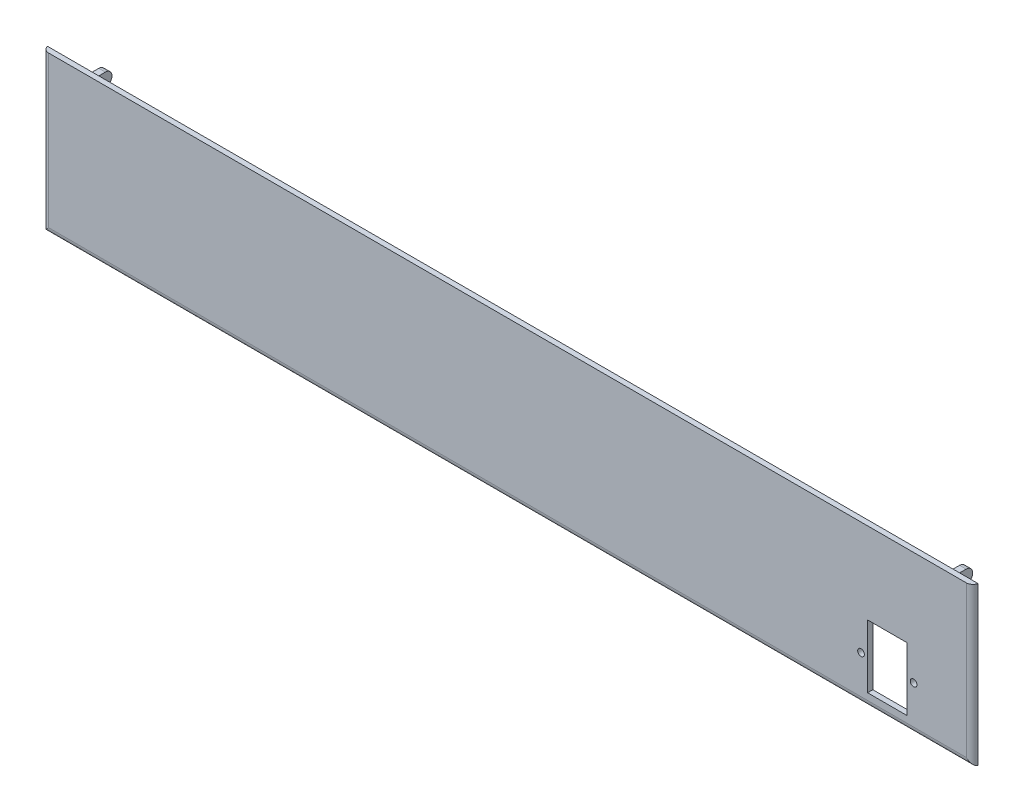
ISO-10303-21;
HEADER;
FILE_DESCRIPTION(('STEP AP214'),'2;1');
FILE_NAME('part.step','',(''),(''),'','','');
FILE_SCHEMA(('AUTOMOTIVE_DESIGN { 1 0 10303 214 1 1 1 1 }'));
ENDSEC;
DATA;
#1=APPLICATION_CONTEXT('core data for automotive mechanical design processes');
#2=APPLICATION_PROTOCOL_DEFINITION('international standard','automotive_design',2000,#1);
#3=PRODUCT_CONTEXT('',#1,'mechanical');
#4=PRODUCT('Part','Part','',(#3));
#5=PRODUCT_RELATED_PRODUCT_CATEGORY('part','',(#4));
#6=PRODUCT_DEFINITION_FORMATION('','',#4);
#7=PRODUCT_DEFINITION_CONTEXT('part definition',#1,'design');
#8=PRODUCT_DEFINITION('design','',#6,#7);
#9=PRODUCT_DEFINITION_SHAPE('','',#8);
#10=(LENGTH_UNIT() NAMED_UNIT(*) SI_UNIT(.MILLI.,.METRE.));
#11=(NAMED_UNIT(*) PLANE_ANGLE_UNIT() SI_UNIT($,.RADIAN.));
#12=(NAMED_UNIT(*) SI_UNIT($,.STERADIAN.) SOLID_ANGLE_UNIT());
#13=UNCERTAINTY_MEASURE_WITH_UNIT(LENGTH_MEASURE(1.E-05),#10,'distance_accuracy_value','');
#14=(GEOMETRIC_REPRESENTATION_CONTEXT(3) GLOBAL_UNCERTAINTY_ASSIGNED_CONTEXT((#13)) GLOBAL_UNIT_ASSIGNED_CONTEXT((#10,
#11,#12)) REPRESENTATION_CONTEXT('',''));
#15=CARTESIAN_POINT('',(0.,0.,0.));
#16=DIRECTION('',(0.,0.,1.));
#17=DIRECTION('',(1.,0.,0.));
#18=AXIS2_PLACEMENT_3D('',#15,#16,#17);
#19=CARTESIAN_POINT('',(0.,0.,0.));
#20=DIRECTION('',(0.,0.,-1.));
#21=DIRECTION('',(-1.,0.,0.));
#22=AXIS2_PLACEMENT_3D('',#19,#20,#21);
#23=PLANE('',#22);
#24=DIRECTION('',(0.,-1.,0.));
#25=VECTOR('',#24,1.);
#26=CARTESIAN_POINT('',(24.,110.,0.));
#27=LINE('',#26,#25);
#28=CARTESIAN_POINT('',(24.,110.,0.));
#29=VERTEX_POINT('',#28);
#30=CARTESIAN_POINT('',(24.,100.,0.));
#31=VERTEX_POINT('',#30);
#32=EDGE_CURVE('E229',#29,#31,#27,.T.);
#33=ORIENTED_EDGE('',*,*,#32,.T.);
#34=DIRECTION('',(1.,0.,0.));
#35=VECTOR('',#34,1.);
#36=CARTESIAN_POINT('',(24.,100.,0.));
#37=LINE('',#36,#35);
#38=CARTESIAN_POINT('',(29.,100.,0.));
#39=VERTEX_POINT('',#38);
#40=EDGE_CURVE('E237',#31,#39,#37,.T.);
#41=ORIENTED_EDGE('',*,*,#40,.T.);
#42=DIRECTION('',(0.,1.,0.));
#43=VECTOR('',#42,1.);
#44=CARTESIAN_POINT('',(29.,110.,0.));
#45=LINE('',#44,#43);
#46=CARTESIAN_POINT('',(29.,110.,0.));
#47=VERTEX_POINT('',#46);
#48=EDGE_CURVE('E251',#39,#47,#45,.T.);
#49=ORIENTED_EDGE('',*,*,#48,.T.);
#50=DIRECTION('',(-1.,0.,0.));
#51=VECTOR('',#50,1.);
#52=CARTESIAN_POINT('',(24.,110.,0.));
#53=LINE('',#52,#51);
#54=EDGE_CURVE('E246',#47,#29,#53,.T.);
#55=ORIENTED_EDGE('',*,*,#54,.T.);
#56=EDGE_LOOP('',(#33,#41,#49,#55));
#57=FACE_BOUND('',#56,.T.);
#58=DIRECTION('',(0.,-1.,0.));
#59=VECTOR('',#58,1.);
#60=CARTESIAN_POINT('',(24.,25.,0.));
#61=LINE('',#60,#59);
#62=CARTESIAN_POINT('',(24.,25.,0.));
#63=VERTEX_POINT('',#62);
#64=CARTESIAN_POINT('',(24.,15.,0.));
#65=VERTEX_POINT('',#64);
#66=EDGE_CURVE('E266',#63,#65,#61,.T.);
#67=ORIENTED_EDGE('',*,*,#66,.T.);
#68=DIRECTION('',(1.,0.,0.));
#69=VECTOR('',#68,1.);
#70=CARTESIAN_POINT('',(24.,15.,0.));
#71=LINE('',#70,#69);
#72=CARTESIAN_POINT('',(29.,15.,0.));
#73=VERTEX_POINT('',#72);
#74=EDGE_CURVE('E275',#65,#73,#71,.T.);
#75=ORIENTED_EDGE('',*,*,#74,.T.);
#76=DIRECTION('',(0.,1.,0.));
#77=VECTOR('',#76,1.);
#78=CARTESIAN_POINT('',(29.,25.,0.));
#79=LINE('',#78,#77);
#80=CARTESIAN_POINT('',(29.,25.,0.));
#81=VERTEX_POINT('',#80);
#82=EDGE_CURVE('E272',#73,#81,#79,.T.);
#83=ORIENTED_EDGE('',*,*,#82,.T.);
#84=DIRECTION('',(-1.,0.,0.));
#85=VECTOR('',#84,1.);
#86=CARTESIAN_POINT('',(24.,25.,0.));
#87=LINE('',#86,#85);
#88=EDGE_CURVE('E269',#81,#63,#87,.T.);
#89=ORIENTED_EDGE('',*,*,#88,.T.);
#90=EDGE_LOOP('',(#67,#75,#83,#89));
#91=FACE_BOUND('',#90,.T.);
#92=DIRECTION('',(0.,-1.,0.));
#93=VECTOR('',#92,1.);
#94=CARTESIAN_POINT('',(684.,25.,0.));
#95=LINE('',#94,#93);
#96=CARTESIAN_POINT('',(684.,25.,0.));
#97=VERTEX_POINT('',#96);
#98=CARTESIAN_POINT('',(684.,15.,0.));
#99=VERTEX_POINT('',#98);
#100=EDGE_CURVE('E316',#97,#99,#95,.T.);
#101=ORIENTED_EDGE('',*,*,#100,.F.);
#102=DIRECTION('',(1.,0.,0.));
#103=VECTOR('',#102,1.);
#104=CARTESIAN_POINT('',(684.,25.,0.));
#105=LINE('',#104,#103);
#106=CARTESIAN_POINT('',(679.,25.,0.));
#107=VERTEX_POINT('',#106);
#108=EDGE_CURVE('E325',#107,#97,#105,.T.);
#109=ORIENTED_EDGE('',*,*,#108,.F.);
#110=DIRECTION('',(0.,1.,0.));
#111=VECTOR('',#110,1.);
#112=CARTESIAN_POINT('',(679.,25.,0.));
#113=LINE('',#112,#111);
#114=CARTESIAN_POINT('',(679.,15.,0.));
#115=VERTEX_POINT('',#114);
#116=EDGE_CURVE('E322',#115,#107,#113,.T.);
#117=ORIENTED_EDGE('',*,*,#116,.F.);
#118=DIRECTION('',(-1.,0.,0.));
#119=VECTOR('',#118,1.);
#120=CARTESIAN_POINT('',(684.,15.,0.));
#121=LINE('',#120,#119);
#122=EDGE_CURVE('E319',#99,#115,#121,.T.);
#123=ORIENTED_EDGE('',*,*,#122,.F.);
#124=EDGE_LOOP('',(#101,#109,#117,#123));
#125=FACE_BOUND('',#124,.T.);
#126=CARTESIAN_POINT('',(663.,34.,0.));
#127=DIRECTION('',(0.,0.,-1.));
#128=DIRECTION('',(-1.,0.,0.));
#129=AXIS2_PLACEMENT_3D('',#126,#127,#128);
#130=CIRCLE('',#129,2.55000000000005);
#131=CARTESIAN_POINT('',(660.45,34.,0.));
#132=VERTEX_POINT('',#131);
#133=EDGE_CURVE('E341',#132,#132,#130,.F.);
#134=ORIENTED_EDGE('',*,*,#133,.T.);
#135=EDGE_LOOP('',(#134));
#136=FACE_BOUND('',#135,.T.);
#137=DIRECTION('',(0.,-1.,0.));
#138=VECTOR('',#137,1.);
#139=CARTESIAN_POINT('',(628.,-1.45254179055125E-12,0.));
#140=LINE('',#139,#138);
#141=CARTESIAN_POINT('',(628.,58.,0.));
#142=VERTEX_POINT('',#141);
#143=CARTESIAN_POINT('',(628.,10.,0.));
#144=VERTEX_POINT('',#143);
#145=EDGE_CURVE('E351',#142,#144,#140,.T.);
#146=ORIENTED_EDGE('',*,*,#145,.T.);
#147=DIRECTION('',(1.,0.,0.));
#148=VECTOR('',#147,1.);
#149=CARTESIAN_POINT('',(0.,10.0000000000001,0.));
#150=LINE('',#149,#148);
#151=CARTESIAN_POINT('',(658.,10.,0.));
#152=VERTEX_POINT('',#151);
#153=EDGE_CURVE('E344',#144,#152,#150,.T.);
#154=ORIENTED_EDGE('',*,*,#153,.T.);
#155=DIRECTION('',(0.,-1.,0.));
#156=VECTOR('',#155,1.);
#157=CARTESIAN_POINT('',(658.,1.52193072959032E-12,0.));
#158=LINE('',#157,#156);
#159=CARTESIAN_POINT('',(658.,58.,0.));
#160=VERTEX_POINT('',#159);
#161=EDGE_CURVE('E345',#160,#152,#158,.T.);
#162=ORIENTED_EDGE('',*,*,#161,.F.);
#163=DIRECTION('',(1.,0.,0.));
#164=VECTOR('',#163,1.);
#165=CARTESIAN_POINT('',(0.,58.,0.));
#166=LINE('',#165,#164);
#167=EDGE_CURVE('E348',#142,#160,#166,.T.);
#168=ORIENTED_EDGE('',*,*,#167,.F.);
#169=EDGE_LOOP('',(#146,#154,#162,#168));
#170=FACE_BOUND('',#169,.T.);
#171=CARTESIAN_POINT('',(623.,34.,0.));
#172=DIRECTION('',(0.,0.,-1.));
#173=DIRECTION('',(-1.,0.,0.));
#174=AXIS2_PLACEMENT_3D('',#171,#172,#173);
#175=CIRCLE('',#174,2.55000000000005);
#176=CARTESIAN_POINT('',(620.45,34.,0.));
#177=VERTEX_POINT('',#176);
#178=EDGE_CURVE('E336',#177,#177,#175,.F.);
#179=ORIENTED_EDGE('',*,*,#178,.T.);
#180=EDGE_LOOP('',(#179));
#181=FACE_BOUND('',#180,.T.);
#182=DIRECTION('',(0.,-1.,0.));
#183=VECTOR('',#182,1.);
#184=CARTESIAN_POINT('',(0.,0.,0.));
#185=LINE('',#184,#183);
#186=CARTESIAN_POINT('',(0.,120.,0.));
#187=VERTEX_POINT('',#186);
#188=CARTESIAN_POINT('',(0.,0.,0.));
#189=VERTEX_POINT('',#188);
#190=EDGE_CURVE('E340',#187,#189,#185,.T.);
#191=ORIENTED_EDGE('',*,*,#190,.F.);
#192=DIRECTION('',(-1.,0.,0.));
#193=VECTOR('',#192,1.);
#194=CARTESIAN_POINT('',(0.,120.,0.));
#195=LINE('',#194,#193);
#196=CARTESIAN_POINT('',(708.,120.,0.));
#197=VERTEX_POINT('',#196);
#198=EDGE_CURVE('E384',#197,#187,#195,.T.);
#199=ORIENTED_EDGE('',*,*,#198,.F.);
#200=DIRECTION('',(0.,1.,0.));
#201=VECTOR('',#200,1.);
#202=CARTESIAN_POINT('',(708.,0.,0.));
#203=LINE('',#202,#201);
#204=CARTESIAN_POINT('',(708.,0.,0.));
#205=VERTEX_POINT('',#204);
#206=EDGE_CURVE('E389',#205,#197,#203,.T.);
#207=ORIENTED_EDGE('',*,*,#206,.F.);
#208=DIRECTION('',(1.,0.,0.));
#209=VECTOR('',#208,1.);
#210=CARTESIAN_POINT('',(0.,0.,0.));
#211=LINE('',#210,#209);
#212=EDGE_CURVE('E386',#189,#205,#211,.T.);
#213=ORIENTED_EDGE('',*,*,#212,.F.);
#214=EDGE_LOOP('',(#191,#199,#207,#213));
#215=FACE_BOUND('',#214,.T.);
#216=DIRECTION('',(-1.,0.,0.));
#217=VECTOR('',#216,1.);
#218=CARTESIAN_POINT('',(684.,100.,0.));
#219=LINE('',#218,#217);
#220=CARTESIAN_POINT('',(684.,100.,0.));
#221=VERTEX_POINT('',#220);
#222=CARTESIAN_POINT('',(679.,100.,0.));
#223=VERTEX_POINT('',#222);
#224=EDGE_CURVE('E294',#221,#223,#219,.T.);
#225=ORIENTED_EDGE('',*,*,#224,.F.);
#226=DIRECTION('',(0.,-1.,0.));
#227=VECTOR('',#226,1.);
#228=CARTESIAN_POINT('',(684.,110.,0.));
#229=LINE('',#228,#227);
#230=CARTESIAN_POINT('',(684.,110.,0.));
#231=VERTEX_POINT('',#230);
#232=EDGE_CURVE('E291',#231,#221,#229,.T.);
#233=ORIENTED_EDGE('',*,*,#232,.F.);
#234=DIRECTION('',(1.,0.,0.));
#235=VECTOR('',#234,1.);
#236=CARTESIAN_POINT('',(684.,110.,0.));
#237=LINE('',#236,#235);
#238=CARTESIAN_POINT('',(679.,110.,0.));
#239=VERTEX_POINT('',#238);
#240=EDGE_CURVE('E300',#239,#231,#237,.T.);
#241=ORIENTED_EDGE('',*,*,#240,.F.);
#242=DIRECTION('',(0.,1.,0.));
#243=VECTOR('',#242,1.);
#244=CARTESIAN_POINT('',(679.,110.,0.));
#245=LINE('',#244,#243);
#246=EDGE_CURVE('E297',#223,#239,#245,.T.);
#247=ORIENTED_EDGE('',*,*,#246,.F.);
#248=EDGE_LOOP('',(#225,#233,#241,#247));
#249=FACE_BOUND('',#248,.T.);
#250=ADVANCED_FACE('F37',(#57,#91,#125,#136,#170,#181,#215,#249),#23,.T.);
#251=CARTESIAN_POINT('',(0.,120.,4.));
#252=DIRECTION('',(0.,-1.,0.));
#253=DIRECTION('',(0.,0.,-1.));
#254=AXIS2_PLACEMENT_3D('',#251,#252,#253);
#255=PLANE('',#254);
#256=ORIENTED_EDGE('',*,*,#198,.T.);
#257=CARTESIAN_POINT('',(4.89897948556636,120.,-1.));
#258=DIRECTION('',(0.,-1.,0.));
#259=DIRECTION('',(0.,0.,-1.));
#260=AXIS2_PLACEMENT_3D('',#257,#258,#259);
#261=CIRCLE('',#260,5.);
#262=CARTESIAN_POINT('',(4.89897948556636,120.,4.));
#263=VERTEX_POINT('',#262);
#264=EDGE_CURVE('E11',#187,#263,#261,.F.);
#265=ORIENTED_EDGE('',*,*,#264,.T.);
#266=DIRECTION('',(-1.,0.,0.));
#267=VECTOR('',#266,1.);
#268=CARTESIAN_POINT('',(0.,120.,4.));
#269=LINE('',#268,#267);
#270=CARTESIAN_POINT('',(703.101020514434,120.,4.));
#271=VERTEX_POINT('',#270);
#272=EDGE_CURVE('E380',#271,#263,#269,.T.);
#273=ORIENTED_EDGE('',*,*,#272,.F.);
#274=CARTESIAN_POINT('',(703.101020514434,120.,-1.));
#275=DIRECTION('',(0.,-1.,0.));
#276=DIRECTION('',(0.,0.,-1.));
#277=AXIS2_PLACEMENT_3D('',#274,#275,#276);
#278=CIRCLE('',#277,5.);
#279=EDGE_CURVE('E46',#271,#197,#278,.F.);
#280=ORIENTED_EDGE('',*,*,#279,.T.);
#281=EDGE_LOOP('',(#256,#265,#273,#280));
#282=FACE_BOUND('',#281,.T.);
#283=ADVANCED_FACE('F474',(#282),#255,.F.);
#284=CARTESIAN_POINT('',(0.,0.,4.));
#285=DIRECTION('',(0.,0.,-1.));
#286=DIRECTION('',(-1.,0.,0.));
#287=AXIS2_PLACEMENT_3D('',#284,#285,#286);
#288=PLANE('',#287);
#289=CARTESIAN_POINT('',(663.,34.,4.));
#290=DIRECTION('',(0.,0.,1.));
#291=DIRECTION('',(1.,0.,0.));
#292=AXIS2_PLACEMENT_3D('',#289,#290,#291);
#293=CIRCLE('',#292,2.55000000000005);
#294=CARTESIAN_POINT('',(665.55,34.,4.));
#295=VERTEX_POINT('',#294);
#296=EDGE_CURVE('E337',#295,#295,#293,.T.);
#297=ORIENTED_EDGE('',*,*,#296,.F.);
#298=EDGE_LOOP('',(#297));
#299=FACE_BOUND('',#298,.T.);
#300=DIRECTION('',(1.,0.,0.));
#301=VECTOR('',#300,1.);
#302=CARTESIAN_POINT('',(0.,10.0000000000001,4.));
#303=LINE('',#302,#301);
#304=CARTESIAN_POINT('',(628.,10.,4.));
#305=VERTEX_POINT('',#304);
#306=CARTESIAN_POINT('',(658.,10.,4.));
#307=VERTEX_POINT('',#306);
#308=EDGE_CURVE('E356',#305,#307,#303,.T.);
#309=ORIENTED_EDGE('',*,*,#308,.F.);
#310=DIRECTION('',(0.,-1.,0.));
#311=VECTOR('',#310,1.);
#312=CARTESIAN_POINT('',(628.,-1.45254179055125E-12,4.));
#313=LINE('',#312,#311);
#314=CARTESIAN_POINT('',(628.,58.,4.));
#315=VERTEX_POINT('',#314);
#316=EDGE_CURVE('E354',#315,#305,#313,.T.);
#317=ORIENTED_EDGE('',*,*,#316,.F.);
#318=DIRECTION('',(1.,0.,0.));
#319=VECTOR('',#318,1.);
#320=CARTESIAN_POINT('',(0.,58.,4.));
#321=LINE('',#320,#319);
#322=CARTESIAN_POINT('',(658.,58.,4.));
#323=VERTEX_POINT('',#322);
#324=EDGE_CURVE('E362',#315,#323,#321,.T.);
#325=ORIENTED_EDGE('',*,*,#324,.T.);
#326=DIRECTION('',(0.,-1.,0.));
#327=VECTOR('',#326,1.);
#328=CARTESIAN_POINT('',(658.,1.52193072959032E-12,4.));
#329=LINE('',#328,#327);
#330=EDGE_CURVE('E359',#323,#307,#329,.T.);
#331=ORIENTED_EDGE('',*,*,#330,.T.);
#332=EDGE_LOOP('',(#309,#317,#325,#331));
#333=FACE_BOUND('',#332,.T.);
#334=CARTESIAN_POINT('',(623.,34.,4.));
#335=DIRECTION('',(0.,0.,1.));
#336=DIRECTION('',(1.,0.,0.));
#337=AXIS2_PLACEMENT_3D('',#334,#335,#336);
#338=CIRCLE('',#337,2.55000000000005);
#339=CARTESIAN_POINT('',(625.55,34.,4.));
#340=VERTEX_POINT('',#339);
#341=EDGE_CURVE('E349',#340,#340,#338,.T.);
#342=ORIENTED_EDGE('',*,*,#341,.F.);
#343=EDGE_LOOP('',(#342));
#344=FACE_BOUND('',#343,.T.);
#345=ORIENTED_EDGE('',*,*,#272,.T.);
#346=DIRECTION('',(0.,1.,0.));
#347=VECTOR('',#346,1.);
#348=CARTESIAN_POINT('',(4.89897948556636,0.,4.));
#349=LINE('',#348,#347);
#350=CARTESIAN_POINT('',(4.89897948556636,4.89897948556636,4.));
#351=VERTEX_POINT('',#350);
#352=EDGE_CURVE('E463',#263,#351,#349,.F.);
#353=ORIENTED_EDGE('',*,*,#352,.T.);
#354=DIRECTION('',(-1.,0.,0.));
#355=VECTOR('',#354,1.);
#356=CARTESIAN_POINT('',(0.,4.89897948556636,4.));
#357=LINE('',#356,#355);
#358=CARTESIAN_POINT('',(703.101020514434,4.89897948556636,4.));
#359=VERTEX_POINT('',#358);
#360=EDGE_CURVE('E61',#351,#359,#357,.F.);
#361=ORIENTED_EDGE('',*,*,#360,.T.);
#362=DIRECTION('',(0.,-1.,0.));
#363=VECTOR('',#362,1.);
#364=CARTESIAN_POINT('',(703.101020514434,0.,4.));
#365=LINE('',#364,#363);
#366=EDGE_CURVE('E457',#359,#271,#365,.F.);
#367=ORIENTED_EDGE('',*,*,#366,.T.);
#368=EDGE_LOOP('',(#345,#353,#361,#367));
#369=FACE_BOUND('',#368,.T.);
#370=ADVANCED_FACE('F472',(#299,#333,#344,#369),#288,.F.);
#371=CARTESIAN_POINT('',(623.,34.,-0.00100000000000013));
#372=DIRECTION('',(0.,0.,1.));
#373=DIRECTION('',(1.,0.,0.));
#374=AXIS2_PLACEMENT_3D('',#371,#372,#373);
#375=CYLINDRICAL_SURFACE('',#374,2.55000000000005);
#376=ORIENTED_EDGE('',*,*,#178,.F.);
#377=EDGE_LOOP('',(#376));
#378=FACE_BOUND('',#377,.T.);
#379=ORIENTED_EDGE('',*,*,#341,.T.);
#380=EDGE_LOOP('',(#379));
#381=FACE_BOUND('',#380,.T.);
#382=ADVANCED_FACE('F825',(#378,#381),#375,.F.);
#383=CARTESIAN_POINT('',(628.,-1.45254179055125E-12,-0.00100000000000013));
#384=DIRECTION('',(-1.,0.,0.));
#385=DIRECTION('',(0.,-1.,0.));
#386=AXIS2_PLACEMENT_3D('',#383,#384,#385);
#387=PLANE('',#386);
#388=DIRECTION('',(0.,0.,1.));
#389=VECTOR('',#388,1.);
#390=CARTESIAN_POINT('',(628.,58.,-0.00100000000000013));
#391=LINE('',#390,#389);
#392=EDGE_CURVE('E366',#142,#315,#391,.T.);
#393=ORIENTED_EDGE('',*,*,#392,.T.);
#394=ORIENTED_EDGE('',*,*,#316,.T.);
#395=DIRECTION('',(0.,0.,1.));
#396=VECTOR('',#395,1.);
#397=CARTESIAN_POINT('',(628.,10.,-0.00100000000000013));
#398=LINE('',#397,#396);
#399=EDGE_CURVE('E365',#144,#305,#398,.T.);
#400=ORIENTED_EDGE('',*,*,#399,.F.);
#401=ORIENTED_EDGE('',*,*,#145,.F.);
#402=EDGE_LOOP('',(#393,#394,#400,#401));
#403=FACE_BOUND('',#402,.T.);
#404=ADVANCED_FACE('F814',(#403),#387,.F.);
#405=CARTESIAN_POINT('',(0.,58.,-0.00100000000000013));
#406=DIRECTION('',(0.,-1.,0.));
#407=DIRECTION('',(0.,0.,-1.));
#408=AXIS2_PLACEMENT_3D('',#405,#406,#407);
#409=PLANE('',#408);
#410=ORIENTED_EDGE('',*,*,#167,.T.);
#411=DIRECTION('',(0.,0.,1.));
#412=VECTOR('',#411,1.);
#413=CARTESIAN_POINT('',(658.,58.,-0.00100000000000013));
#414=LINE('',#413,#412);
#415=EDGE_CURVE('E368',#160,#323,#414,.T.);
#416=ORIENTED_EDGE('',*,*,#415,.T.);
#417=ORIENTED_EDGE('',*,*,#324,.F.);
#418=ORIENTED_EDGE('',*,*,#392,.F.);
#419=EDGE_LOOP('',(#410,#416,#417,#418));
#420=FACE_BOUND('',#419,.T.);
#421=ADVANCED_FACE('F803',(#420),#409,.T.);
#422=CARTESIAN_POINT('',(658.,1.52193072959032E-12,-0.00100000000000013));
#423=DIRECTION('',(-1.,0.,0.));
#424=DIRECTION('',(0.,-1.,0.));
#425=AXIS2_PLACEMENT_3D('',#422,#423,#424);
#426=PLANE('',#425);
#427=ORIENTED_EDGE('',*,*,#161,.T.);
#428=DIRECTION('',(0.,0.,1.));
#429=VECTOR('',#428,1.);
#430=CARTESIAN_POINT('',(658.,10.,-0.00100000000000013));
#431=LINE('',#430,#429);
#432=EDGE_CURVE('E370',#152,#307,#431,.T.);
#433=ORIENTED_EDGE('',*,*,#432,.T.);
#434=ORIENTED_EDGE('',*,*,#330,.F.);
#435=ORIENTED_EDGE('',*,*,#415,.F.);
#436=EDGE_LOOP('',(#427,#433,#434,#435));
#437=FACE_BOUND('',#436,.T.);
#438=ADVANCED_FACE('F792',(#437),#426,.T.);
#439=CARTESIAN_POINT('',(0.,10.0000000000001,-0.00100000000000013));
#440=DIRECTION('',(0.,-1.,0.));
#441=DIRECTION('',(1.,0.,0.));
#442=AXIS2_PLACEMENT_3D('',#439,#440,#441);
#443=PLANE('',#442);
#444=ORIENTED_EDGE('',*,*,#399,.T.);
#445=ORIENTED_EDGE('',*,*,#308,.T.);
#446=ORIENTED_EDGE('',*,*,#432,.F.);
#447=ORIENTED_EDGE('',*,*,#153,.F.);
#448=EDGE_LOOP('',(#444,#445,#446,#447));
#449=FACE_BOUND('',#448,.T.);
#450=ADVANCED_FACE('F781',(#449),#443,.F.);
#451=CARTESIAN_POINT('',(663.,34.,-0.00100000000000013));
#452=DIRECTION('',(0.,0.,1.));
#453=DIRECTION('',(1.,0.,0.));
#454=AXIS2_PLACEMENT_3D('',#451,#452,#453);
#455=CYLINDRICAL_SURFACE('',#454,2.55000000000005);
#456=ORIENTED_EDGE('',*,*,#133,.F.);
#457=EDGE_LOOP('',(#456));
#458=FACE_BOUND('',#457,.T.);
#459=ORIENTED_EDGE('',*,*,#296,.T.);
#460=EDGE_LOOP('',(#459));
#461=FACE_BOUND('',#460,.T.);
#462=ADVANCED_FACE('F762',(#458,#461),#455,.F.);
#463=CARTESIAN_POINT('',(684.,25.,-20.));
#464=DIRECTION('',(-1.,0.,0.));
#465=DIRECTION('',(0.,0.,1.));
#466=AXIS2_PLACEMENT_3D('',#463,#464,#465);
#467=PLANE('',#466);
#468=CARTESIAN_POINT('',(684.,20.,-10.));
#469=DIRECTION('',(1.,0.,0.));
#470=DIRECTION('',(0.,0.,-1.));
#471=AXIS2_PLACEMENT_3D('',#468,#469,#470);
#472=CIRCLE('',#471,2.6);
#473=CARTESIAN_POINT('',(684.,20.,-12.6));
#474=VERTEX_POINT('',#473);
#475=EDGE_CURVE('E312',#474,#474,#472,.T.);
#476=ORIENTED_EDGE('',*,*,#475,.F.);
#477=EDGE_LOOP('',(#476));
#478=FACE_BOUND('',#477,.T.);
#479=DIRECTION('',(0.,0.,1.));
#480=VECTOR('',#479,1.);
#481=CARTESIAN_POINT('',(684.,15.,-20.));
#482=LINE('',#481,#480);
#483=CARTESIAN_POINT('',(684.,15.,-15.));
#484=VERTEX_POINT('',#483);
#485=EDGE_CURVE('E334',#484,#99,#482,.T.);
#486=ORIENTED_EDGE('',*,*,#485,.F.);
#487=CARTESIAN_POINT('',(684.,20.,-15.));
#488=DIRECTION('',(-1.,0.,0.));
#489=DIRECTION('',(0.,0.,1.));
#490=AXIS2_PLACEMENT_3D('',#487,#488,#489);
#491=CIRCLE('',#490,5.);
#492=CARTESIAN_POINT('',(684.,20.,-20.));
#493=VERTEX_POINT('',#492);
#494=EDGE_CURVE('E403',#484,#493,#491,.F.);
#495=ORIENTED_EDGE('',*,*,#494,.T.);
#496=CARTESIAN_POINT('',(684.,20.,-15.));
#497=DIRECTION('',(-1.,0.,0.));
#498=DIRECTION('',(0.,0.,1.));
#499=AXIS2_PLACEMENT_3D('',#496,#497,#498);
#500=CIRCLE('',#499,5.);
#501=CARTESIAN_POINT('',(684.,25.,-15.));
#502=VERTEX_POINT('',#501);
#503=EDGE_CURVE('E401',#493,#502,#500,.F.);
#504=ORIENTED_EDGE('',*,*,#503,.T.);
#505=DIRECTION('',(0.,0.,1.));
#506=VECTOR('',#505,1.);
#507=CARTESIAN_POINT('',(684.,25.,-20.));
#508=LINE('',#507,#506);
#509=EDGE_CURVE('E328',#502,#97,#508,.T.);
#510=ORIENTED_EDGE('',*,*,#509,.T.);
#511=ORIENTED_EDGE('',*,*,#100,.T.);
#512=EDGE_LOOP('',(#486,#495,#504,#510,#511));
#513=FACE_BOUND('',#512,.T.);
#514=ADVANCED_FACE('F751',(#478,#513),#467,.F.);
#515=CARTESIAN_POINT('',(684.,15.,-20.));
#516=DIRECTION('',(0.,1.,0.));
#517=DIRECTION('',(0.,0.,1.));
#518=AXIS2_PLACEMENT_3D('',#515,#516,#517);
#519=PLANE('',#518);
#520=DIRECTION('',(0.,0.,1.));
#521=VECTOR('',#520,1.);
#522=CARTESIAN_POINT('',(679.,15.,-20.));
#523=LINE('',#522,#521);
#524=CARTESIAN_POINT('',(679.,15.,-15.));
#525=VERTEX_POINT('',#524);
#526=EDGE_CURVE('E332',#525,#115,#523,.T.);
#527=ORIENTED_EDGE('',*,*,#526,.F.);
#528=DIRECTION('',(-1.,0.,0.));
#529=VECTOR('',#528,1.);
#530=CARTESIAN_POINT('',(684.,15.,-15.));
#531=LINE('',#530,#529);
#532=EDGE_CURVE('E398',#525,#484,#531,.F.);
#533=ORIENTED_EDGE('',*,*,#532,.T.);
#534=ORIENTED_EDGE('',*,*,#485,.T.);
#535=ORIENTED_EDGE('',*,*,#122,.T.);
#536=EDGE_LOOP('',(#527,#533,#534,#535));
#537=FACE_BOUND('',#536,.T.);
#538=ADVANCED_FACE('F740',(#537),#519,.F.);
#539=CARTESIAN_POINT('',(679.,25.,-20.));
#540=DIRECTION('',(1.,0.,0.));
#541=DIRECTION('',(0.,0.,-1.));
#542=AXIS2_PLACEMENT_3D('',#539,#540,#541);
#543=PLANE('',#542);
#544=CARTESIAN_POINT('',(679.,20.,-10.));
#545=DIRECTION('',(1.,0.,0.));
#546=DIRECTION('',(0.,0.,-1.));
#547=AXIS2_PLACEMENT_3D('',#544,#545,#546);
#548=CIRCLE('',#547,2.6);
#549=CARTESIAN_POINT('',(679.,20.,-12.6));
#550=VERTEX_POINT('',#549);
#551=EDGE_CURVE('E315',#550,#550,#548,.T.);
#552=ORIENTED_EDGE('',*,*,#551,.T.);
#553=EDGE_LOOP('',(#552));
#554=FACE_BOUND('',#553,.T.);
#555=CARTESIAN_POINT('',(679.,20.,-15.));
#556=DIRECTION('',(1.,0.,0.));
#557=DIRECTION('',(0.,0.,-1.));
#558=AXIS2_PLACEMENT_3D('',#555,#556,#557);
#559=CIRCLE('',#558,5.);
#560=CARTESIAN_POINT('',(679.,25.,-15.));
#561=VERTEX_POINT('',#560);
#562=CARTESIAN_POINT('',(679.,20.,-20.));
#563=VERTEX_POINT('',#562);
#564=EDGE_CURVE('E383',#561,#563,#559,.F.);
#565=ORIENTED_EDGE('',*,*,#564,.T.);
#566=CARTESIAN_POINT('',(679.,20.,-15.));
#567=DIRECTION('',(1.,0.,0.));
#568=DIRECTION('',(0.,0.,-1.));
#569=AXIS2_PLACEMENT_3D('',#566,#567,#568);
#570=CIRCLE('',#569,5.);
#571=EDGE_CURVE('E396',#563,#525,#570,.F.);
#572=ORIENTED_EDGE('',*,*,#571,.T.);
#573=ORIENTED_EDGE('',*,*,#526,.T.);
#574=ORIENTED_EDGE('',*,*,#116,.T.);
#575=DIRECTION('',(0.,0.,1.));
#576=VECTOR('',#575,1.);
#577=CARTESIAN_POINT('',(679.,25.,-20.));
#578=LINE('',#577,#576);
#579=EDGE_CURVE('E330',#561,#107,#578,.T.);
#580=ORIENTED_EDGE('',*,*,#579,.F.);
#581=EDGE_LOOP('',(#565,#572,#573,#574,#580));
#582=FACE_BOUND('',#581,.T.);
#583=ADVANCED_FACE('F729',(#554,#582),#543,.F.);
#584=CARTESIAN_POINT('',(684.,25.,-20.));
#585=DIRECTION('',(0.,-1.,0.));
#586=DIRECTION('',(0.,0.,-1.));
#587=AXIS2_PLACEMENT_3D('',#584,#585,#586);
#588=PLANE('',#587);
#589=ORIENTED_EDGE('',*,*,#509,.F.);
#590=DIRECTION('',(1.,0.,0.));
#591=VECTOR('',#590,1.);
#592=CARTESIAN_POINT('',(679.,25.,-15.));
#593=LINE('',#592,#591);
#594=EDGE_CURVE('E405',#502,#561,#593,.F.);
#595=ORIENTED_EDGE('',*,*,#594,.T.);
#596=ORIENTED_EDGE('',*,*,#579,.T.);
#597=ORIENTED_EDGE('',*,*,#108,.T.);
#598=EDGE_LOOP('',(#589,#595,#596,#597));
#599=FACE_BOUND('',#598,.T.);
#600=ADVANCED_FACE('F724',(#599),#588,.F.);
#601=CARTESIAN_POINT('',(664.,20.,-10.));
#602=DIRECTION('',(1.,0.,0.));
#603=DIRECTION('',(0.,0.,-1.));
#604=AXIS2_PLACEMENT_3D('',#601,#602,#603);
#605=CYLINDRICAL_SURFACE('',#604,2.6);
#606=ORIENTED_EDGE('',*,*,#475,.T.);
#607=EDGE_LOOP('',(#606));
#608=FACE_BOUND('',#607,.T.);
#609=ORIENTED_EDGE('',*,*,#551,.F.);
#610=EDGE_LOOP('',(#609));
#611=FACE_BOUND('',#610,.T.);
#612=ADVANCED_FACE('F716',(#608,#611),#605,.F.);
#613=CARTESIAN_POINT('',(0.,20.,-15.));
#614=DIRECTION('',(-1.,0.,0.));
#615=DIRECTION('',(0.,0.,1.));
#616=AXIS2_PLACEMENT_3D('',#613,#614,#615);
#617=CYLINDRICAL_SURFACE('',#616,5.);
#618=ORIENTED_EDGE('',*,*,#594,.F.);
#619=ORIENTED_EDGE('',*,*,#503,.F.);
#620=DIRECTION('',(1.,0.,0.));
#621=VECTOR('',#620,1.);
#622=CARTESIAN_POINT('',(684.,20.,-20.));
#623=LINE('',#622,#621);
#624=EDGE_CURVE('E311',#563,#493,#623,.T.);
#625=ORIENTED_EDGE('',*,*,#624,.F.);
#626=ORIENTED_EDGE('',*,*,#564,.F.);
#627=EDGE_LOOP('',(#618,#619,#625,#626));
#628=FACE_BOUND('',#627,.T.);
#629=ADVANCED_FACE('F705',(#628),#617,.T.);
#630=CARTESIAN_POINT('',(0.,20.,-15.));
#631=DIRECTION('',(1.,0.,0.));
#632=DIRECTION('',(0.,0.,-1.));
#633=AXIS2_PLACEMENT_3D('',#630,#631,#632);
#634=CYLINDRICAL_SURFACE('',#633,5.);
#635=ORIENTED_EDGE('',*,*,#494,.F.);
#636=ORIENTED_EDGE('',*,*,#532,.F.);
#637=ORIENTED_EDGE('',*,*,#571,.F.);
#638=ORIENTED_EDGE('',*,*,#624,.T.);
#639=EDGE_LOOP('',(#635,#636,#637,#638));
#640=FACE_BOUND('',#639,.T.);
#641=ADVANCED_FACE('F693',(#640),#634,.T.);
#642=CARTESIAN_POINT('',(684.,110.,-20.));
#643=DIRECTION('',(-1.,0.,0.));
#644=DIRECTION('',(0.,0.,1.));
#645=AXIS2_PLACEMENT_3D('',#642,#643,#644);
#646=PLANE('',#645);
#647=CARTESIAN_POINT('',(684.,105.,-10.));
#648=DIRECTION('',(1.,0.,0.));
#649=DIRECTION('',(0.,0.,-1.));
#650=AXIS2_PLACEMENT_3D('',#647,#648,#649);
#651=CIRCLE('',#650,2.6);
#652=CARTESIAN_POINT('',(684.,105.,-12.6));
#653=VERTEX_POINT('',#652);
#654=EDGE_CURVE('E287',#653,#653,#651,.T.);
#655=ORIENTED_EDGE('',*,*,#654,.F.);
#656=EDGE_LOOP('',(#655));
#657=FACE_BOUND('',#656,.T.);
#658=DIRECTION('',(0.,0.,1.));
#659=VECTOR('',#658,1.);
#660=CARTESIAN_POINT('',(684.,100.,-20.));
#661=LINE('',#660,#659);
#662=CARTESIAN_POINT('',(684.,100.,-15.));
#663=VERTEX_POINT('',#662);
#664=EDGE_CURVE('E309',#663,#221,#661,.T.);
#665=ORIENTED_EDGE('',*,*,#664,.F.);
#666=CARTESIAN_POINT('',(684.,105.,-15.));
#667=DIRECTION('',(-1.,0.,0.));
#668=DIRECTION('',(0.,0.,1.));
#669=AXIS2_PLACEMENT_3D('',#666,#667,#668);
#670=CIRCLE('',#669,5.);
#671=CARTESIAN_POINT('',(684.,105.,-20.));
#672=VERTEX_POINT('',#671);
#673=EDGE_CURVE('E420',#663,#672,#670,.F.);
#674=ORIENTED_EDGE('',*,*,#673,.T.);
#675=CARTESIAN_POINT('',(684.,105.,-15.));
#676=DIRECTION('',(-1.,0.,0.));
#677=DIRECTION('',(0.,0.,1.));
#678=AXIS2_PLACEMENT_3D('',#675,#676,#677);
#679=CIRCLE('',#678,5.);
#680=CARTESIAN_POINT('',(684.,110.,-15.));
#681=VERTEX_POINT('',#680);
#682=EDGE_CURVE('E418',#672,#681,#679,.F.);
#683=ORIENTED_EDGE('',*,*,#682,.T.);
#684=DIRECTION('',(0.,0.,1.));
#685=VECTOR('',#684,1.);
#686=CARTESIAN_POINT('',(684.,110.,-20.));
#687=LINE('',#686,#685);
#688=EDGE_CURVE('E303',#681,#231,#687,.T.);
#689=ORIENTED_EDGE('',*,*,#688,.T.);
#690=ORIENTED_EDGE('',*,*,#232,.T.);
#691=EDGE_LOOP('',(#665,#674,#683,#689,#690));
#692=FACE_BOUND('',#691,.T.);
#693=ADVANCED_FACE('F493',(#657,#692),#646,.F.);
#694=CARTESIAN_POINT('',(684.,100.,-20.));
#695=DIRECTION('',(0.,1.,0.));
#696=DIRECTION('',(0.,0.,1.));
#697=AXIS2_PLACEMENT_3D('',#694,#695,#696);
#698=PLANE('',#697);
#699=DIRECTION('',(0.,0.,1.));
#700=VECTOR('',#699,1.);
#701=CARTESIAN_POINT('',(679.,100.,-20.));
#702=LINE('',#701,#700);
#703=CARTESIAN_POINT('',(679.,100.,-15.));
#704=VERTEX_POINT('',#703);
#705=EDGE_CURVE('E307',#704,#223,#702,.T.);
#706=ORIENTED_EDGE('',*,*,#705,.F.);
#707=DIRECTION('',(-1.,0.,0.));
#708=VECTOR('',#707,1.);
#709=CARTESIAN_POINT('',(684.,100.,-15.));
#710=LINE('',#709,#708);
#711=EDGE_CURVE('E415',#704,#663,#710,.F.);
#712=ORIENTED_EDGE('',*,*,#711,.T.);
#713=ORIENTED_EDGE('',*,*,#664,.T.);
#714=ORIENTED_EDGE('',*,*,#224,.T.);
#715=EDGE_LOOP('',(#706,#712,#713,#714));
#716=FACE_BOUND('',#715,.T.);
#717=ADVANCED_FACE('F489',(#716),#698,.F.);
#718=CARTESIAN_POINT('',(679.,110.,-20.));
#719=DIRECTION('',(1.,0.,0.));
#720=DIRECTION('',(0.,0.,-1.));
#721=AXIS2_PLACEMENT_3D('',#718,#719,#720);
#722=PLANE('',#721);
#723=CARTESIAN_POINT('',(679.,105.,-10.));
#724=DIRECTION('',(1.,0.,0.));
#725=DIRECTION('',(0.,0.,-1.));
#726=AXIS2_PLACEMENT_3D('',#723,#724,#725);
#727=CIRCLE('',#726,2.6);
#728=CARTESIAN_POINT('',(679.,105.,-12.6));
#729=VERTEX_POINT('',#728);
#730=EDGE_CURVE('E290',#729,#729,#727,.T.);
#731=ORIENTED_EDGE('',*,*,#730,.T.);
#732=EDGE_LOOP('',(#731));
#733=FACE_BOUND('',#732,.T.);
#734=CARTESIAN_POINT('',(679.,105.,-15.));
#735=DIRECTION('',(1.,0.,0.));
#736=DIRECTION('',(0.,0.,-1.));
#737=AXIS2_PLACEMENT_3D('',#734,#735,#736);
#738=CIRCLE('',#737,5.);
#739=CARTESIAN_POINT('',(679.,110.,-15.));
#740=VERTEX_POINT('',#739);
#741=CARTESIAN_POINT('',(679.,105.,-20.));
#742=VERTEX_POINT('',#741);
#743=EDGE_CURVE('E407',#740,#742,#738,.F.);
#744=ORIENTED_EDGE('',*,*,#743,.T.);
#745=CARTESIAN_POINT('',(679.,105.,-15.));
#746=DIRECTION('',(1.,0.,0.));
#747=DIRECTION('',(0.,0.,-1.));
#748=AXIS2_PLACEMENT_3D('',#745,#746,#747);
#749=CIRCLE('',#748,5.);
#750=EDGE_CURVE('E413',#742,#704,#749,.F.);
#751=ORIENTED_EDGE('',*,*,#750,.T.);
#752=ORIENTED_EDGE('',*,*,#705,.T.);
#753=ORIENTED_EDGE('',*,*,#246,.T.);
#754=DIRECTION('',(0.,0.,1.));
#755=VECTOR('',#754,1.);
#756=CARTESIAN_POINT('',(679.,110.,-20.));
#757=LINE('',#756,#755);
#758=EDGE_CURVE('E305',#740,#239,#757,.T.);
#759=ORIENTED_EDGE('',*,*,#758,.F.);
#760=EDGE_LOOP('',(#744,#751,#752,#753,#759));
#761=FACE_BOUND('',#760,.T.);
#762=ADVANCED_FACE('F502',(#733,#761),#722,.F.);
#763=CARTESIAN_POINT('',(684.,110.,-20.));
#764=DIRECTION('',(0.,-1.,0.));
#765=DIRECTION('',(0.,0.,-1.));
#766=AXIS2_PLACEMENT_3D('',#763,#764,#765);
#767=PLANE('',#766);
#768=ORIENTED_EDGE('',*,*,#688,.F.);
#769=DIRECTION('',(1.,0.,0.));
#770=VECTOR('',#769,1.);
#771=CARTESIAN_POINT('',(679.,110.,-15.));
#772=LINE('',#771,#770);
#773=EDGE_CURVE('E422',#681,#740,#772,.F.);
#774=ORIENTED_EDGE('',*,*,#773,.T.);
#775=ORIENTED_EDGE('',*,*,#758,.T.);
#776=ORIENTED_EDGE('',*,*,#240,.T.);
#777=EDGE_LOOP('',(#768,#774,#775,#776));
#778=FACE_BOUND('',#777,.T.);
#779=ADVANCED_FACE('F498',(#778),#767,.F.);
#780=CARTESIAN_POINT('',(664.,105.,-10.));
#781=DIRECTION('',(1.,0.,0.));
#782=DIRECTION('',(0.,0.,-1.));
#783=AXIS2_PLACEMENT_3D('',#780,#781,#782);
#784=CYLINDRICAL_SURFACE('',#783,2.6);
#785=ORIENTED_EDGE('',*,*,#654,.T.);
#786=EDGE_LOOP('',(#785));
#787=FACE_BOUND('',#786,.T.);
#788=ORIENTED_EDGE('',*,*,#730,.F.);
#789=EDGE_LOOP('',(#788));
#790=FACE_BOUND('',#789,.T.);
#791=ADVANCED_FACE('F510',(#787,#790),#784,.F.);
#792=CARTESIAN_POINT('',(0.,105.,-15.));
#793=DIRECTION('',(-1.,0.,0.));
#794=DIRECTION('',(0.,0.,1.));
#795=AXIS2_PLACEMENT_3D('',#792,#793,#794);
#796=CYLINDRICAL_SURFACE('',#795,5.);
#797=ORIENTED_EDGE('',*,*,#773,.F.);
#798=ORIENTED_EDGE('',*,*,#682,.F.);
#799=DIRECTION('',(1.,0.,0.));
#800=VECTOR('',#799,1.);
#801=CARTESIAN_POINT('',(684.,105.,-20.));
#802=LINE('',#801,#800);
#803=EDGE_CURVE('E286',#742,#672,#802,.T.);
#804=ORIENTED_EDGE('',*,*,#803,.F.);
#805=ORIENTED_EDGE('',*,*,#743,.F.);
#806=EDGE_LOOP('',(#797,#798,#804,#805));
#807=FACE_BOUND('',#806,.T.);
#808=ADVANCED_FACE('F508',(#807),#796,.T.);
#809=CARTESIAN_POINT('',(0.,105.,-15.));
#810=DIRECTION('',(1.,0.,0.));
#811=DIRECTION('',(0.,0.,-1.));
#812=AXIS2_PLACEMENT_3D('',#809,#810,#811);
#813=CYLINDRICAL_SURFACE('',#812,5.);
#814=ORIENTED_EDGE('',*,*,#673,.F.);
#815=ORIENTED_EDGE('',*,*,#711,.F.);
#816=ORIENTED_EDGE('',*,*,#750,.F.);
#817=ORIENTED_EDGE('',*,*,#803,.T.);
#818=EDGE_LOOP('',(#814,#815,#816,#817));
#819=FACE_BOUND('',#818,.T.);
#820=ADVANCED_FACE('F506',(#819),#813,.T.);
#821=CARTESIAN_POINT('',(24.,25.,-20.));
#822=DIRECTION('',(-1.,0.,0.));
#823=DIRECTION('',(0.,0.,1.));
#824=AXIS2_PLACEMENT_3D('',#821,#822,#823);
#825=PLANE('',#824);
#826=CARTESIAN_POINT('',(24.,20.,-10.));
#827=DIRECTION('',(1.,0.,0.));
#828=DIRECTION('',(0.,0.,-1.));
#829=AXIS2_PLACEMENT_3D('',#826,#827,#828);
#830=CIRCLE('',#829,2.6);
#831=CARTESIAN_POINT('',(24.,20.,-12.6));
#832=VERTEX_POINT('',#831);
#833=EDGE_CURVE('E262',#832,#832,#830,.T.);
#834=ORIENTED_EDGE('',*,*,#833,.T.);
#835=EDGE_LOOP('',(#834));
#836=FACE_BOUND('',#835,.T.);
#837=CARTESIAN_POINT('',(24.,20.,-15.));
#838=DIRECTION('',(-1.,0.,0.));
#839=DIRECTION('',(0.,0.,1.));
#840=AXIS2_PLACEMENT_3D('',#837,#838,#839);
#841=CIRCLE('',#840,5.);
#842=CARTESIAN_POINT('',(24.,25.,-15.));
#843=VERTEX_POINT('',#842);
#844=CARTESIAN_POINT('',(24.,20.,-20.));
#845=VERTEX_POINT('',#844);
#846=EDGE_CURVE('E435',#843,#845,#841,.T.);
#847=ORIENTED_EDGE('',*,*,#846,.T.);
#848=CARTESIAN_POINT('',(24.,20.,-15.));
#849=DIRECTION('',(-1.,0.,0.));
#850=DIRECTION('',(0.,0.,1.));
#851=AXIS2_PLACEMENT_3D('',#848,#849,#850);
#852=CIRCLE('',#851,5.);
#853=CARTESIAN_POINT('',(24.,15.,-15.));
#854=VERTEX_POINT('',#853);
#855=EDGE_CURVE('E437',#845,#854,#852,.T.);
#856=ORIENTED_EDGE('',*,*,#855,.T.);
#857=DIRECTION('',(0.,0.,1.));
#858=VECTOR('',#857,1.);
#859=CARTESIAN_POINT('',(24.,15.,-20.));
#860=LINE('',#859,#858);
#861=EDGE_CURVE('E278',#854,#65,#860,.T.);
#862=ORIENTED_EDGE('',*,*,#861,.T.);
#863=ORIENTED_EDGE('',*,*,#66,.F.);
#864=DIRECTION('',(0.,0.,1.));
#865=VECTOR('',#864,1.);
#866=CARTESIAN_POINT('',(24.,25.,-20.));
#867=LINE('',#866,#865);
#868=EDGE_CURVE('E284',#843,#63,#867,.T.);
#869=ORIENTED_EDGE('',*,*,#868,.F.);
#870=EDGE_LOOP('',(#847,#856,#862,#863,#869));
#871=FACE_BOUND('',#870,.T.);
#872=ADVANCED_FACE('F516',(#836,#871),#825,.T.);
#873=CARTESIAN_POINT('',(24.,25.,-20.));
#874=DIRECTION('',(0.,1.,0.));
#875=DIRECTION('',(0.,0.,1.));
#876=AXIS2_PLACEMENT_3D('',#873,#874,#875);
#877=PLANE('',#876);
#878=DIRECTION('',(0.,0.,1.));
#879=VECTOR('',#878,1.);
#880=CARTESIAN_POINT('',(29.,25.,-20.));
#881=LINE('',#880,#879);
#882=CARTESIAN_POINT('',(29.,25.,-15.));
#883=VERTEX_POINT('',#882);
#884=EDGE_CURVE('E282',#883,#81,#881,.T.);
#885=ORIENTED_EDGE('',*,*,#884,.F.);
#886=DIRECTION('',(-1.,0.,0.));
#887=VECTOR('',#886,1.);
#888=CARTESIAN_POINT('',(24.,25.,-15.));
#889=LINE('',#888,#887);
#890=EDGE_CURVE('E439',#883,#843,#889,.T.);
#891=ORIENTED_EDGE('',*,*,#890,.T.);
#892=ORIENTED_EDGE('',*,*,#868,.T.);
#893=ORIENTED_EDGE('',*,*,#88,.F.);
#894=EDGE_LOOP('',(#885,#891,#892,#893));
#895=FACE_BOUND('',#894,.T.);
#896=ADVANCED_FACE('F623',(#895),#877,.T.);
#897=CARTESIAN_POINT('',(29.,25.,-20.));
#898=DIRECTION('',(1.,0.,0.));
#899=DIRECTION('',(0.,0.,-1.));
#900=AXIS2_PLACEMENT_3D('',#897,#898,#899);
#901=PLANE('',#900);
#902=CARTESIAN_POINT('',(29.,20.,-10.));
#903=DIRECTION('',(1.,0.,0.));
#904=DIRECTION('',(0.,0.,-1.));
#905=AXIS2_PLACEMENT_3D('',#902,#903,#904);
#906=CIRCLE('',#905,2.6);
#907=CARTESIAN_POINT('',(29.,20.,-12.6));
#908=VERTEX_POINT('',#907);
#909=EDGE_CURVE('E265',#908,#908,#906,.F.);
#910=ORIENTED_EDGE('',*,*,#909,.T.);
#911=EDGE_LOOP('',(#910));
#912=FACE_BOUND('',#911,.T.);
#913=DIRECTION('',(0.,0.,1.));
#914=VECTOR('',#913,1.);
#915=CARTESIAN_POINT('',(29.,15.,-20.));
#916=LINE('',#915,#914);
#917=CARTESIAN_POINT('',(29.,15.,-15.));
#918=VERTEX_POINT('',#917);
#919=EDGE_CURVE('E280',#918,#73,#916,.T.);
#920=ORIENTED_EDGE('',*,*,#919,.F.);
#921=CARTESIAN_POINT('',(29.,20.,-15.));
#922=DIRECTION('',(1.,0.,0.));
#923=DIRECTION('',(0.,0.,-1.));
#924=AXIS2_PLACEMENT_3D('',#921,#922,#923);
#925=CIRCLE('',#924,5.);
#926=CARTESIAN_POINT('',(29.,20.,-20.));
#927=VERTEX_POINT('',#926);
#928=EDGE_CURVE('E433',#918,#927,#925,.T.);
#929=ORIENTED_EDGE('',*,*,#928,.T.);
#930=CARTESIAN_POINT('',(29.,20.,-15.));
#931=DIRECTION('',(1.,0.,0.));
#932=DIRECTION('',(0.,0.,-1.));
#933=AXIS2_PLACEMENT_3D('',#930,#931,#932);
#934=CIRCLE('',#933,5.);
#935=EDGE_CURVE('E431',#927,#883,#934,.T.);
#936=ORIENTED_EDGE('',*,*,#935,.T.);
#937=ORIENTED_EDGE('',*,*,#884,.T.);
#938=ORIENTED_EDGE('',*,*,#82,.F.);
#939=EDGE_LOOP('',(#920,#929,#936,#937,#938));
#940=FACE_BOUND('',#939,.T.);
#941=ADVANCED_FACE('F615',(#912,#940),#901,.T.);
#942=CARTESIAN_POINT('',(24.,15.,-20.));
#943=DIRECTION('',(0.,-1.,0.));
#944=DIRECTION('',(0.,0.,-1.));
#945=AXIS2_PLACEMENT_3D('',#942,#943,#944);
#946=PLANE('',#945);
#947=ORIENTED_EDGE('',*,*,#861,.F.);
#948=DIRECTION('',(1.,0.,0.));
#949=VECTOR('',#948,1.);
#950=CARTESIAN_POINT('',(24.,15.,-15.));
#951=LINE('',#950,#949);
#952=EDGE_CURVE('E424',#854,#918,#951,.T.);
#953=ORIENTED_EDGE('',*,*,#952,.T.);
#954=ORIENTED_EDGE('',*,*,#919,.T.);
#955=ORIENTED_EDGE('',*,*,#74,.F.);
#956=EDGE_LOOP('',(#947,#953,#954,#955));
#957=FACE_BOUND('',#956,.T.);
#958=ADVANCED_FACE('F607',(#957),#946,.T.);
#959=CARTESIAN_POINT('',(44.,20.,-10.));
#960=DIRECTION('',(-1.,0.,0.));
#961=DIRECTION('',(0.,0.,1.));
#962=AXIS2_PLACEMENT_3D('',#959,#960,#961);
#963=CYLINDRICAL_SURFACE('',#962,2.6);
#964=ORIENTED_EDGE('',*,*,#909,.F.);
#965=EDGE_LOOP('',(#964));
#966=FACE_BOUND('',#965,.T.);
#967=ORIENTED_EDGE('',*,*,#833,.F.);
#968=EDGE_LOOP('',(#967));
#969=FACE_BOUND('',#968,.T.);
#970=ADVANCED_FACE('F529',(#966,#969),#963,.F.);
#971=CARTESIAN_POINT('',(24.,20.,-15.));
#972=DIRECTION('',(-1.,0.,0.));
#973=DIRECTION('',(0.,0.,1.));
#974=AXIS2_PLACEMENT_3D('',#971,#972,#973);
#975=CYLINDRICAL_SURFACE('',#974,5.);
#976=DIRECTION('',(-1.,0.,0.));
#977=VECTOR('',#976,1.);
#978=CARTESIAN_POINT('',(708.,20.,-20.));
#979=LINE('',#978,#977);
#980=EDGE_CURVE('E261',#845,#927,#979,.F.);
#981=ORIENTED_EDGE('',*,*,#980,.F.);
#982=ORIENTED_EDGE('',*,*,#846,.F.);
#983=ORIENTED_EDGE('',*,*,#890,.F.);
#984=ORIENTED_EDGE('',*,*,#935,.F.);
#985=EDGE_LOOP('',(#981,#982,#983,#984));
#986=FACE_BOUND('',#985,.T.);
#987=ADVANCED_FACE('F525',(#986),#975,.T.);
#988=CARTESIAN_POINT('',(24.,20.,-15.));
#989=DIRECTION('',(1.,0.,0.));
#990=DIRECTION('',(0.,0.,-1.));
#991=AXIS2_PLACEMENT_3D('',#988,#989,#990);
#992=CYLINDRICAL_SURFACE('',#991,5.);
#993=ORIENTED_EDGE('',*,*,#855,.F.);
#994=ORIENTED_EDGE('',*,*,#980,.T.);
#995=ORIENTED_EDGE('',*,*,#928,.F.);
#996=ORIENTED_EDGE('',*,*,#952,.F.);
#997=EDGE_LOOP('',(#993,#994,#995,#996));
#998=FACE_BOUND('',#997,.T.);
#999=ADVANCED_FACE('F522',(#998),#992,.T.);
#1000=CARTESIAN_POINT('',(24.,110.,-20.));
#1001=DIRECTION('',(-1.,0.,0.));
#1002=DIRECTION('',(0.,0.,1.));
#1003=AXIS2_PLACEMENT_3D('',#1000,#1001,#1002);
#1004=PLANE('',#1003);
#1005=CARTESIAN_POINT('',(24.,105.,-10.));
#1006=DIRECTION('',(1.,0.,0.));
#1007=DIRECTION('',(0.,0.,-1.));
#1008=AXIS2_PLACEMENT_3D('',#1005,#1006,#1007);
#1009=CIRCLE('',#1008,2.6);
#1010=CARTESIAN_POINT('',(24.,105.,-12.6));
#1011=VERTEX_POINT('',#1010);
#1012=EDGE_CURVE('E446',#1011,#1011,#1009,.T.);
#1013=ORIENTED_EDGE('',*,*,#1012,.T.);
#1014=EDGE_LOOP('',(#1013));
#1015=FACE_BOUND('',#1014,.T.);
#1016=CARTESIAN_POINT('',(24.,105.,-15.));
#1017=DIRECTION('',(-1.,0.,0.));
#1018=DIRECTION('',(0.,0.,1.));
#1019=AXIS2_PLACEMENT_3D('',#1016,#1017,#1018);
#1020=CIRCLE('',#1019,5.);
#1021=CARTESIAN_POINT('',(24.,110.,-15.));
#1022=VERTEX_POINT('',#1021);
#1023=CARTESIAN_POINT('',(24.,105.,-20.));
#1024=VERTEX_POINT('',#1023);
#1025=EDGE_CURVE('E452',#1022,#1024,#1020,.T.);
#1026=ORIENTED_EDGE('',*,*,#1025,.T.);
#1027=CARTESIAN_POINT('',(24.,105.,-15.));
#1028=DIRECTION('',(-1.,0.,0.));
#1029=DIRECTION('',(0.,0.,1.));
#1030=AXIS2_PLACEMENT_3D('',#1027,#1028,#1029);
#1031=CIRCLE('',#1030,5.);
#1032=CARTESIAN_POINT('',(24.,100.,-15.));
#1033=VERTEX_POINT('',#1032);
#1034=EDGE_CURVE('E231',#1024,#1033,#1031,.T.);
#1035=ORIENTED_EDGE('',*,*,#1034,.T.);
#1036=DIRECTION('',(0.,0.,1.));
#1037=VECTOR('',#1036,1.);
#1038=CARTESIAN_POINT('',(24.,100.,-20.));
#1039=LINE('',#1038,#1037);
#1040=EDGE_CURVE('E225',#1033,#31,#1039,.T.);
#1041=ORIENTED_EDGE('',*,*,#1040,.T.);
#1042=ORIENTED_EDGE('',*,*,#32,.F.);
#1043=DIRECTION('',(0.,0.,1.));
#1044=VECTOR('',#1043,1.);
#1045=CARTESIAN_POINT('',(24.,110.,-20.));
#1046=LINE('',#1045,#1044);
#1047=EDGE_CURVE('E259',#1022,#29,#1046,.T.);
#1048=ORIENTED_EDGE('',*,*,#1047,.F.);
#1049=EDGE_LOOP('',(#1026,#1035,#1041,#1042,#1048));
#1050=FACE_BOUND('',#1049,.T.);
#1051=ADVANCED_FACE('F227',(#1015,#1050),#1004,.T.);
#1052=CARTESIAN_POINT('',(24.,110.,-20.));
#1053=DIRECTION('',(0.,1.,0.));
#1054=DIRECTION('',(0.,0.,1.));
#1055=AXIS2_PLACEMENT_3D('',#1052,#1053,#1054);
#1056=PLANE('',#1055);
#1057=DIRECTION('',(0.,0.,1.));
#1058=VECTOR('',#1057,1.);
#1059=CARTESIAN_POINT('',(29.,110.,-20.));
#1060=LINE('',#1059,#1058);
#1061=CARTESIAN_POINT('',(29.,110.,-15.));
#1062=VERTEX_POINT('',#1061);
#1063=EDGE_CURVE('E257',#1062,#47,#1060,.T.);
#1064=ORIENTED_EDGE('',*,*,#1063,.F.);
#1065=DIRECTION('',(-1.,0.,0.));
#1066=VECTOR('',#1065,1.);
#1067=CARTESIAN_POINT('',(24.,110.,-15.));
#1068=LINE('',#1067,#1066);
#1069=EDGE_CURVE('E455',#1062,#1022,#1068,.T.);
#1070=ORIENTED_EDGE('',*,*,#1069,.T.);
#1071=ORIENTED_EDGE('',*,*,#1047,.T.);
#1072=ORIENTED_EDGE('',*,*,#54,.F.);
#1073=EDGE_LOOP('',(#1064,#1070,#1071,#1072));
#1074=FACE_BOUND('',#1073,.T.);
#1075=ADVANCED_FACE('F577',(#1074),#1056,.T.);
#1076=CARTESIAN_POINT('',(29.,110.,-20.));
#1077=DIRECTION('',(1.,0.,0.));
#1078=DIRECTION('',(0.,0.,-1.));
#1079=AXIS2_PLACEMENT_3D('',#1076,#1077,#1078);
#1080=PLANE('',#1079);
#1081=CARTESIAN_POINT('',(29.,105.,-10.));
#1082=DIRECTION('',(1.,0.,0.));
#1083=DIRECTION('',(0.,0.,-1.));
#1084=AXIS2_PLACEMENT_3D('',#1081,#1082,#1083);
#1085=CIRCLE('',#1084,2.6);
#1086=CARTESIAN_POINT('',(29.,105.,-12.6));
#1087=VERTEX_POINT('',#1086);
#1088=EDGE_CURVE('E247',#1087,#1087,#1085,.F.);
#1089=ORIENTED_EDGE('',*,*,#1088,.T.);
#1090=EDGE_LOOP('',(#1089));
#1091=FACE_BOUND('',#1090,.T.);
#1092=DIRECTION('',(0.,0.,1.));
#1093=VECTOR('',#1092,1.);
#1094=CARTESIAN_POINT('',(29.,100.,-20.));
#1095=LINE('',#1094,#1093);
#1096=CARTESIAN_POINT('',(29.,100.,-15.));
#1097=VERTEX_POINT('',#1096);
#1098=EDGE_CURVE('E236',#1097,#39,#1095,.T.);
#1099=ORIENTED_EDGE('',*,*,#1098,.F.);
#1100=CARTESIAN_POINT('',(29.,105.,-15.));
#1101=DIRECTION('',(1.,0.,0.));
#1102=DIRECTION('',(0.,0.,-1.));
#1103=AXIS2_PLACEMENT_3D('',#1100,#1101,#1102);
#1104=CIRCLE('',#1103,5.);
#1105=CARTESIAN_POINT('',(29.,105.,-20.));
#1106=VERTEX_POINT('',#1105);
#1107=EDGE_CURVE('E450',#1097,#1106,#1104,.T.);
#1108=ORIENTED_EDGE('',*,*,#1107,.T.);
#1109=CARTESIAN_POINT('',(29.,105.,-15.));
#1110=DIRECTION('',(1.,0.,0.));
#1111=DIRECTION('',(0.,0.,-1.));
#1112=AXIS2_PLACEMENT_3D('',#1109,#1110,#1111);
#1113=CIRCLE('',#1112,5.);
#1114=EDGE_CURVE('E448',#1106,#1062,#1113,.T.);
#1115=ORIENTED_EDGE('',*,*,#1114,.T.);
#1116=ORIENTED_EDGE('',*,*,#1063,.T.);
#1117=ORIENTED_EDGE('',*,*,#48,.F.);
#1118=EDGE_LOOP('',(#1099,#1108,#1115,#1116,#1117));
#1119=FACE_BOUND('',#1118,.T.);
#1120=ADVANCED_FACE('F570',(#1091,#1119),#1080,.T.);
#1121=CARTESIAN_POINT('',(24.,100.,-20.));
#1122=DIRECTION('',(0.,-1.,0.));
#1123=DIRECTION('',(0.,0.,-1.));
#1124=AXIS2_PLACEMENT_3D('',#1121,#1122,#1123);
#1125=PLANE('',#1124);
#1126=ORIENTED_EDGE('',*,*,#1040,.F.);
#1127=DIRECTION('',(1.,0.,0.));
#1128=VECTOR('',#1127,1.);
#1129=CARTESIAN_POINT('',(24.,100.,-15.));
#1130=LINE('',#1129,#1128);
#1131=EDGE_CURVE('E441',#1033,#1097,#1130,.T.);
#1132=ORIENTED_EDGE('',*,*,#1131,.T.);
#1133=ORIENTED_EDGE('',*,*,#1098,.T.);
#1134=ORIENTED_EDGE('',*,*,#40,.F.);
#1135=EDGE_LOOP('',(#1126,#1132,#1133,#1134));
#1136=FACE_BOUND('',#1135,.T.);
#1137=ADVANCED_FACE('F249',(#1136),#1125,.T.);
#1138=CARTESIAN_POINT('',(44.,105.,-10.));
#1139=DIRECTION('',(-1.,0.,0.));
#1140=DIRECTION('',(0.,0.,1.));
#1141=AXIS2_PLACEMENT_3D('',#1138,#1139,#1140);
#1142=CYLINDRICAL_SURFACE('',#1141,2.6);
#1143=ORIENTED_EDGE('',*,*,#1088,.F.);
#1144=EDGE_LOOP('',(#1143));
#1145=FACE_BOUND('',#1144,.T.);
#1146=ORIENTED_EDGE('',*,*,#1012,.F.);
#1147=EDGE_LOOP('',(#1146));
#1148=FACE_BOUND('',#1147,.T.);
#1149=ADVANCED_FACE('F538',(#1145,#1148),#1142,.F.);
#1150=CARTESIAN_POINT('',(24.,105.,-15.));
#1151=DIRECTION('',(-1.,0.,0.));
#1152=DIRECTION('',(0.,0.,1.));
#1153=AXIS2_PLACEMENT_3D('',#1150,#1151,#1152);
#1154=CYLINDRICAL_SURFACE('',#1153,5.);
#1155=DIRECTION('',(-1.,0.,0.));
#1156=VECTOR('',#1155,1.);
#1157=CARTESIAN_POINT('',(708.,105.,-20.));
#1158=LINE('',#1157,#1156);
#1159=EDGE_CURVE('E458',#1024,#1106,#1158,.F.);
#1160=ORIENTED_EDGE('',*,*,#1159,.F.);
#1161=ORIENTED_EDGE('',*,*,#1025,.F.);
#1162=ORIENTED_EDGE('',*,*,#1069,.F.);
#1163=ORIENTED_EDGE('',*,*,#1114,.F.);
#1164=EDGE_LOOP('',(#1160,#1161,#1162,#1163));
#1165=FACE_BOUND('',#1164,.T.);
#1166=ADVANCED_FACE('F534',(#1165),#1154,.T.);
#1167=CARTESIAN_POINT('',(24.,105.,-15.));
#1168=DIRECTION('',(1.,0.,0.));
#1169=DIRECTION('',(0.,0.,-1.));
#1170=AXIS2_PLACEMENT_3D('',#1167,#1168,#1169);
#1171=CYLINDRICAL_SURFACE('',#1170,5.);
#1172=ORIENTED_EDGE('',*,*,#1034,.F.);
#1173=ORIENTED_EDGE('',*,*,#1159,.T.);
#1174=ORIENTED_EDGE('',*,*,#1107,.F.);
#1175=ORIENTED_EDGE('',*,*,#1131,.F.);
#1176=EDGE_LOOP('',(#1172,#1173,#1174,#1175));
#1177=FACE_BOUND('',#1176,.T.);
#1178=ADVANCED_FACE('F531',(#1177),#1171,.T.);
#1179=CARTESIAN_POINT('',(703.101020514434,0.,-1.));
#1180=DIRECTION('',(0.,-1.,0.));
#1181=DIRECTION('',(0.,0.,-1.));
#1182=AXIS2_PLACEMENT_3D('',#1179,#1180,#1181);
#1183=CYLINDRICAL_SURFACE('',#1182,5.);
#1184=ORIENTED_EDGE('',*,*,#279,.F.);
#1185=ORIENTED_EDGE('',*,*,#366,.F.);
#1186=CARTESIAN_POINT('',(703.101020514434,4.89897948556636,-1.));
#1187=DIRECTION('',(-0.707106781186547,-0.707106781186547,0.));
#1188=DIRECTION('',(0.707106781186547,-0.707106781186547,0.));
#1189=AXIS2_PLACEMENT_3D('',#1186,#1187,#1188);
#1190=ELLIPSE('',#1189,7.07106781186547,5.);
#1191=EDGE_CURVE('E41',#205,#359,#1190,.T.);
#1192=ORIENTED_EDGE('',*,*,#1191,.F.);
#1193=ORIENTED_EDGE('',*,*,#206,.T.);
#1194=EDGE_LOOP('',(#1184,#1185,#1192,#1193));
#1195=FACE_BOUND('',#1194,.T.);
#1196=ADVANCED_FACE('F39',(#1195),#1183,.T.);
#1197=CARTESIAN_POINT('',(0.,4.89897948556636,-1.));
#1198=DIRECTION('',(-1.,0.,0.));
#1199=DIRECTION('',(0.,0.,1.));
#1200=AXIS2_PLACEMENT_3D('',#1197,#1198,#1199);
#1201=CYLINDRICAL_SURFACE('',#1200,5.);
#1202=ORIENTED_EDGE('',*,*,#1191,.T.);
#1203=ORIENTED_EDGE('',*,*,#360,.F.);
#1204=CARTESIAN_POINT('',(4.89897948556636,4.89897948556636,-1.));
#1205=DIRECTION('',(-0.707106781186547,0.707106781186547,0.));
#1206=DIRECTION('',(-0.707106781186547,-0.707106781186547,0.));
#1207=AXIS2_PLACEMENT_3D('',#1204,#1205,#1206);
#1208=ELLIPSE('',#1207,7.07106781186547,5.);
#1209=EDGE_CURVE('E54',#189,#351,#1208,.T.);
#1210=ORIENTED_EDGE('',*,*,#1209,.F.);
#1211=ORIENTED_EDGE('',*,*,#212,.T.);
#1212=EDGE_LOOP('',(#1202,#1203,#1210,#1211));
#1213=FACE_BOUND('',#1212,.T.);
#1214=ADVANCED_FACE('F468',(#1213),#1201,.T.);
#1215=CARTESIAN_POINT('',(4.89897948556636,0.,-1.));
#1216=DIRECTION('',(0.,1.,0.));
#1217=DIRECTION('',(0.,0.,1.));
#1218=AXIS2_PLACEMENT_3D('',#1215,#1216,#1217);
#1219=CYLINDRICAL_SURFACE('',#1218,5.);
#1220=ORIENTED_EDGE('',*,*,#264,.F.);
#1221=ORIENTED_EDGE('',*,*,#190,.T.);
#1222=ORIENTED_EDGE('',*,*,#1209,.T.);
#1223=ORIENTED_EDGE('',*,*,#352,.F.);
#1224=EDGE_LOOP('',(#1220,#1221,#1222,#1223));
#1225=FACE_BOUND('',#1224,.T.);
#1226=ADVANCED_FACE('F478',(#1225),#1219,.T.);
#1227=CLOSED_SHELL('',(#250,#283,#370,#382,#404,#421,#438,#450,#462,#514,#538,#583,#600,#612,
#629,#641,#693,#717,#762,#779,#791,#808,#820,#872,#896,#941,#958,#970,#987,#999,#1051,#1075,
#1120,#1137,#1149,#1166,#1178,#1196,#1214,#1226));
#1228=MANIFOLD_SOLID_BREP('B2',#1227);
#1229=ADVANCED_BREP_SHAPE_REPRESENTATION('',(#18,#1228),#14);
#1230=SHAPE_DEFINITION_REPRESENTATION(#9,#1229);
ENDSEC;
END-ISO-10303-21;
